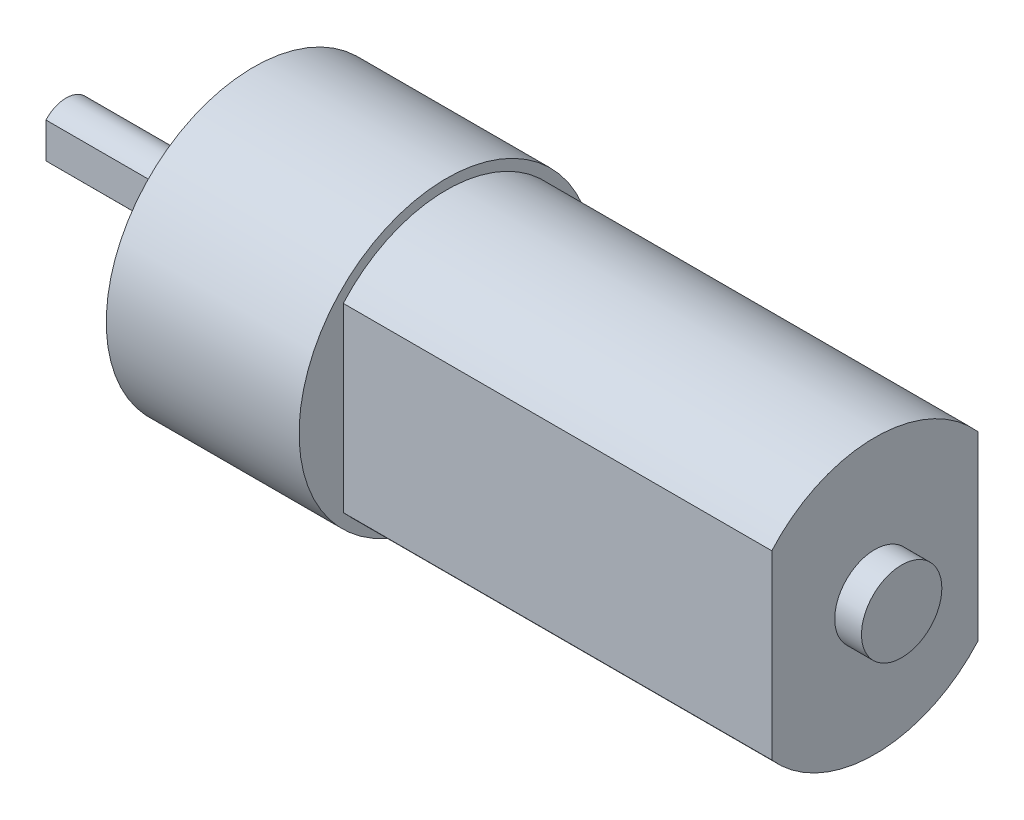
ISO-10303-21;
HEADER;
FILE_DESCRIPTION(('STEP AP214'),'2;1');
FILE_NAME('part.step','',(''),(''),'','','');
FILE_SCHEMA(('AUTOMOTIVE_DESIGN { 1 0 10303 214 1 1 1 1 }'));
ENDSEC;
DATA;
#1=APPLICATION_CONTEXT('core data for automotive mechanical design processes');
#2=APPLICATION_PROTOCOL_DEFINITION('international standard','automotive_design',2000,#1);
#3=PRODUCT_CONTEXT('',#1,'mechanical');
#4=PRODUCT('Part','Part','',(#3));
#5=PRODUCT_RELATED_PRODUCT_CATEGORY('part','',(#4));
#6=PRODUCT_DEFINITION_FORMATION('','',#4);
#7=PRODUCT_DEFINITION_CONTEXT('part definition',#1,'design');
#8=PRODUCT_DEFINITION('design','',#6,#7);
#9=PRODUCT_DEFINITION_SHAPE('','',#8);
#10=(LENGTH_UNIT() NAMED_UNIT(*) SI_UNIT(.MILLI.,.METRE.));
#11=(NAMED_UNIT(*) PLANE_ANGLE_UNIT() SI_UNIT($,.RADIAN.));
#12=(NAMED_UNIT(*) SI_UNIT($,.STERADIAN.) SOLID_ANGLE_UNIT());
#13=UNCERTAINTY_MEASURE_WITH_UNIT(LENGTH_MEASURE(1.E-05),#10,'distance_accuracy_value','');
#14=(GEOMETRIC_REPRESENTATION_CONTEXT(3) GLOBAL_UNCERTAINTY_ASSIGNED_CONTEXT((#13)) GLOBAL_UNIT_ASSIGNED_CONTEXT((#10,
#11,#12)) REPRESENTATION_CONTEXT('',''));
#15=CARTESIAN_POINT('',(0.,0.,0.));
#16=DIRECTION('',(0.,0.,1.));
#17=DIRECTION('',(1.,0.,0.));
#18=AXIS2_PLACEMENT_3D('',#15,#16,#17);
#19=CARTESIAN_POINT('',(38.7033994714384,0.,0.));
#20=DIRECTION('',(1.,0.,0.));
#21=DIRECTION('',(0.,0.,-1.));
#22=AXIS2_PLACEMENT_3D('',#19,#20,#21);
#23=CYLINDRICAL_SURFACE('',#22,7.00000000000001);
#24=CARTESIAN_POINT('',(-2.,0.,0.));
#25=DIRECTION('',(1.,0.,0.));
#26=DIRECTION('',(0.,0.,-1.));
#27=AXIS2_PLACEMENT_3D('',#24,#25,#26);
#28=CIRCLE('',#27,7.00000000000001);
#29=CARTESIAN_POINT('',(-2.,1.69313093032285,6.79215044391569));
#30=VERTEX_POINT('',#29);
#31=CARTESIAN_POINT('',(-2.,-6.79215044391568,-1.69313093032292));
#32=VERTEX_POINT('',#31);
#33=EDGE_CURVE('E187',#30,#32,#28,.T.);
#34=ORIENTED_EDGE('',*,*,#33,.T.);
#35=DIRECTION('',(-1.,0.,0.));
#36=VECTOR('',#35,1.);
#37=CARTESIAN_POINT('',(7.211102550928,-6.79215044391568,-1.69313093032292));
#38=LINE('',#37,#36);
#39=CARTESIAN_POINT('',(0.,-6.79215044391568,-1.69313093032292));
#40=VERTEX_POINT('',#39);
#41=EDGE_CURVE('E463',#40,#32,#38,.T.);
#42=ORIENTED_EDGE('',*,*,#41,.F.);
#43=CARTESIAN_POINT('',(0.,0.,0.));
#44=DIRECTION('',(1.,0.,0.));
#45=DIRECTION('',(0.,0.,-1.));
#46=AXIS2_PLACEMENT_3D('',#43,#44,#45);
#47=CIRCLE('',#46,7.00000000000001);
#48=CARTESIAN_POINT('',(0.,1.69313093032285,6.79215044391569));
#49=VERTEX_POINT('',#48);
#50=EDGE_CURVE('E178',#49,#40,#47,.T.);
#51=ORIENTED_EDGE('',*,*,#50,.F.);
#52=DIRECTION('',(-1.,0.,0.));
#53=VECTOR('',#52,1.);
#54=CARTESIAN_POINT('',(7.211102550928,1.69313093032285,6.79215044391569));
#55=LINE('',#54,#53);
#56=EDGE_CURVE('E461',#49,#30,#55,.T.);
#57=ORIENTED_EDGE('',*,*,#56,.T.);
#58=EDGE_LOOP('',(#34,#42,#51,#57));
#59=FACE_BOUND('',#58,.T.);
#60=ADVANCED_FACE('F33',(#59),#23,.T.);
#61=CARTESIAN_POINT('',(38.7033994714384,0.,0.));
#62=DIRECTION('',(1.,0.,0.));
#63=DIRECTION('',(0.,0.,-1.));
#64=AXIS2_PLACEMENT_3D('',#61,#62,#63);
#65=CYLINDRICAL_SURFACE('',#64,10.25);
#66=CARTESIAN_POINT('',(14.4,0.,0.));
#67=DIRECTION('',(1.,0.,0.));
#68=DIRECTION('',(0.,0.,-1.));
#69=AXIS2_PLACEMENT_3D('',#66,#67,#68);
#70=CIRCLE('',#69,10.25);
#71=CARTESIAN_POINT('',(14.4,-6.76553767264657,7.7));
#72=VERTEX_POINT('',#71);
#73=CARTESIAN_POINT('',(14.4,-6.76553767264657,-7.7));
#74=VERTEX_POINT('',#73);
#75=EDGE_CURVE('E448',#72,#74,#70,.T.);
#76=ORIENTED_EDGE('',*,*,#75,.T.);
#77=DIRECTION('',(1.,0.,0.));
#78=VECTOR('',#77,1.);
#79=CARTESIAN_POINT('',(38.7033994714384,-6.76553767264657,-7.7));
#80=LINE('',#79,#78);
#81=CARTESIAN_POINT('',(46.4,-6.76553767264656,-7.7));
#82=VERTEX_POINT('',#81);
#83=EDGE_CURVE('E480',#74,#82,#80,.T.);
#84=ORIENTED_EDGE('',*,*,#83,.T.);
#85=CARTESIAN_POINT('',(46.4,0.,0.));
#86=DIRECTION('',(1.,0.,0.));
#87=DIRECTION('',(0.,0.,-1.));
#88=AXIS2_PLACEMENT_3D('',#85,#86,#87);
#89=CIRCLE('',#88,10.25);
#90=CARTESIAN_POINT('',(46.4,-6.76553767264657,7.7));
#91=VERTEX_POINT('',#90);
#92=EDGE_CURVE('E440',#91,#82,#89,.T.);
#93=ORIENTED_EDGE('',*,*,#92,.F.);
#94=DIRECTION('',(1.,0.,0.));
#95=VECTOR('',#94,1.);
#96=CARTESIAN_POINT('',(38.7033994714384,-6.76553767264657,7.7));
#97=LINE('',#96,#95);
#98=EDGE_CURVE('E486',#91,#72,#97,.F.);
#99=ORIENTED_EDGE('',*,*,#98,.T.);
#100=EDGE_LOOP('',(#76,#84,#93,#99));
#101=FACE_BOUND('',#100,.T.);
#102=ADVANCED_FACE('F144',(#101),#65,.T.);
#103=CARTESIAN_POINT('',(-14.,0.,0.));
#104=DIRECTION('',(1.,0.,0.));
#105=DIRECTION('',(0.,0.,-1.));
#106=AXIS2_PLACEMENT_3D('',#103,#104,#105);
#107=PLANE('',#106);
#108=CARTESIAN_POINT('',(-14.,0.,0.));
#109=DIRECTION('',(1.,0.,0.));
#110=DIRECTION('',(0.,0.,-1.));
#111=AXIS2_PLACEMENT_3D('',#108,#109,#110);
#112=CIRCLE('',#111,2.00000000000001);
#113=CARTESIAN_POINT('',(-14.,-1.32287565553231,1.49999999999999));
#114=VERTEX_POINT('',#113);
#115=CARTESIAN_POINT('',(-14.,1.32287565553231,1.49999999999999));
#116=VERTEX_POINT('',#115);
#117=EDGE_CURVE('E117',#114,#116,#112,.T.);
#118=ORIENTED_EDGE('',*,*,#117,.F.);
#119=DIRECTION('',(0.,-1.,0.));
#120=VECTOR('',#119,1.);
#121=CARTESIAN_POINT('',(-14.,9.36225720990517,1.49999999999999));
#122=LINE('',#121,#120);
#123=EDGE_CURVE('E110',#116,#114,#122,.T.);
#124=ORIENTED_EDGE('',*,*,#123,.F.);
#125=EDGE_LOOP('',(#118,#124));
#126=FACE_BOUND('',#125,.T.);
#127=ADVANCED_FACE('F35',(#126),#107,.F.);
#128=CARTESIAN_POINT('',(38.7033994714384,0.,0.));
#129=DIRECTION('',(1.,0.,0.));
#130=DIRECTION('',(0.,0.,-1.));
#131=AXIS2_PLACEMENT_3D('',#128,#129,#130);
#132=CYLINDRICAL_SURFACE('',#131,2.00000000000001);
#133=ORIENTED_EDGE('',*,*,#117,.T.);
#134=DIRECTION('',(1.,0.,0.));
#135=VECTOR('',#134,1.);
#136=CARTESIAN_POINT('',(38.7033994714384,1.32287565553231,1.49999999999999));
#137=LINE('',#136,#135);
#138=CARTESIAN_POINT('',(-6.00000000000001,1.32287565553231,1.49999999999999));
#139=VERTEX_POINT('',#138);
#140=EDGE_CURVE('E11',#116,#139,#137,.T.);
#141=ORIENTED_EDGE('',*,*,#140,.T.);
#142=CARTESIAN_POINT('',(-6.00000000000001,0.,0.));
#143=DIRECTION('',(1.,0.,0.));
#144=DIRECTION('',(0.,0.,-1.));
#145=AXIS2_PLACEMENT_3D('',#142,#143,#144);
#146=CIRCLE('',#145,2.00000000000001);
#147=CARTESIAN_POINT('',(-6.00000000000001,-1.32287565553231,1.49999999999999));
#148=VERTEX_POINT('',#147);
#149=EDGE_CURVE('E134',#139,#148,#146,.T.);
#150=ORIENTED_EDGE('',*,*,#149,.T.);
#151=DIRECTION('',(1.,0.,0.));
#152=VECTOR('',#151,1.);
#153=CARTESIAN_POINT('',(38.7033994714384,-1.32287565553231,1.49999999999999));
#154=LINE('',#153,#152);
#155=EDGE_CURVE('E41',#148,#114,#154,.F.);
#156=ORIENTED_EDGE('',*,*,#155,.T.);
#157=EDGE_LOOP('',(#133,#141,#150,#156));
#158=FACE_BOUND('',#157,.T.);
#159=CARTESIAN_POINT('',(-3.,0.,0.));
#160=DIRECTION('',(1.,0.,0.));
#161=DIRECTION('',(0.,0.,-1.));
#162=AXIS2_PLACEMENT_3D('',#159,#160,#161);
#163=CIRCLE('',#162,2.00000000000001);
#164=CARTESIAN_POINT('',(-3.,0.,-2.00000000000001));
#165=VERTEX_POINT('',#164);
#166=EDGE_CURVE('E122',#165,#165,#163,.T.);
#167=ORIENTED_EDGE('',*,*,#166,.F.);
#168=EDGE_LOOP('',(#167));
#169=FACE_BOUND('',#168,.T.);
#170=ADVANCED_FACE('F119',(#158,#169),#132,.T.);
#171=CARTESIAN_POINT('',(-3.,-2.00000000000001,0.));
#172=DIRECTION('',(1.,0.,0.));
#173=DIRECTION('',(0.,0.,-1.));
#174=AXIS2_PLACEMENT_3D('',#171,#172,#173);
#175=PLANE('',#174);
#176=CARTESIAN_POINT('',(-3.,0.,0.));
#177=DIRECTION('',(1.,0.,0.));
#178=DIRECTION('',(0.,0.,-1.));
#179=AXIS2_PLACEMENT_3D('',#176,#177,#178);
#180=CIRCLE('',#179,4.00000000000001);
#181=CARTESIAN_POINT('',(-3.,0.,-4.00000000000001));
#182=VERTEX_POINT('',#181);
#183=EDGE_CURVE('E128',#182,#182,#180,.T.);
#184=ORIENTED_EDGE('',*,*,#183,.F.);
#185=EDGE_LOOP('',(#184));
#186=FACE_BOUND('',#185,.T.);
#187=ORIENTED_EDGE('',*,*,#166,.T.);
#188=EDGE_LOOP('',(#187));
#189=FACE_BOUND('',#188,.T.);
#190=ADVANCED_FACE('F195',(#186,#189),#175,.F.);
#191=CARTESIAN_POINT('',(38.7033994714384,0.,0.));
#192=DIRECTION('',(1.,0.,0.));
#193=DIRECTION('',(0.,0.,-1.));
#194=AXIS2_PLACEMENT_3D('',#191,#192,#193);
#195=CYLINDRICAL_SURFACE('',#194,4.00000000000001);
#196=CARTESIAN_POINT('',(-2.,0.,0.));
#197=DIRECTION('',(1.,0.,0.));
#198=DIRECTION('',(0.,0.,-1.));
#199=AXIS2_PLACEMENT_3D('',#196,#197,#198);
#200=CIRCLE('',#199,4.00000000000001);
#201=CARTESIAN_POINT('',(-2.,0.,-4.00000000000001));
#202=VERTEX_POINT('',#201);
#203=EDGE_CURVE('E189',#202,#202,#200,.T.);
#204=ORIENTED_EDGE('',*,*,#203,.F.);
#205=EDGE_LOOP('',(#204));
#206=FACE_BOUND('',#205,.T.);
#207=ORIENTED_EDGE('',*,*,#183,.T.);
#208=EDGE_LOOP('',(#207));
#209=FACE_BOUND('',#208,.T.);
#210=ADVANCED_FACE('F167',(#206,#209),#195,.T.);
#211=CARTESIAN_POINT('',(-2.,-4.00000000000001,0.));
#212=DIRECTION('',(1.,0.,0.));
#213=DIRECTION('',(0.,0.,-1.));
#214=AXIS2_PLACEMENT_3D('',#211,#212,#213);
#215=PLANE('',#214);
#216=CARTESIAN_POINT('',(-2.,-1.69313093032285,-6.79215044391569));
#217=VERTEX_POINT('',#216);
#218=CARTESIAN_POINT('',(-2.,6.79215044391567,1.69313093032292));
#219=VERTEX_POINT('',#218);
#220=EDGE_CURVE('E181',#217,#219,#28,.T.);
#221=ORIENTED_EDGE('',*,*,#220,.F.);
#222=DIRECTION('',(0.,0.707106781186551,-0.707106781186544));
#223=VECTOR('',#222,1.);
#224=CARTESIAN_POINT('',(-2.,-1.69313093032285,-6.79215044391569));
#225=LINE('',#224,#223);
#226=EDGE_CURVE('E497',#32,#217,#225,.T.);
#227=ORIENTED_EDGE('',*,*,#226,.F.);
#228=ORIENTED_EDGE('',*,*,#33,.F.);
#229=DIRECTION('',(0.,-0.707106781186551,0.707106781186544));
#230=VECTOR('',#229,1.);
#231=CARTESIAN_POINT('',(-2.,1.69313093032285,6.79215044391569));
#232=LINE('',#231,#230);
#233=EDGE_CURVE('E465',#219,#30,#232,.T.);
#234=ORIENTED_EDGE('',*,*,#233,.F.);
#235=EDGE_LOOP('',(#221,#227,#228,#234));
#236=FACE_BOUND('',#235,.T.);
#237=ORIENTED_EDGE('',*,*,#203,.T.);
#238=EDGE_LOOP('',(#237));
#239=FACE_BOUND('',#238,.T.);
#240=ADVANCED_FACE('F159',(#236,#239),#215,.F.);
#241=CARTESIAN_POINT('',(0.,-1.69313093032285,-6.79215044391569));
#242=VERTEX_POINT('',#241);
#243=CARTESIAN_POINT('',(0.,6.79215044391567,1.69313093032292));
#244=VERTEX_POINT('',#243);
#245=EDGE_CURVE('E172',#242,#244,#47,.T.);
#246=ORIENTED_EDGE('',*,*,#245,.F.);
#247=DIRECTION('',(-1.,0.,0.));
#248=VECTOR('',#247,1.);
#249=CARTESIAN_POINT('',(7.211102550928,-1.69313093032285,-6.79215044391569));
#250=LINE('',#249,#248);
#251=EDGE_CURVE('E173',#242,#217,#250,.T.);
#252=ORIENTED_EDGE('',*,*,#251,.T.);
#253=ORIENTED_EDGE('',*,*,#220,.T.);
#254=DIRECTION('',(-1.,0.,0.));
#255=VECTOR('',#254,1.);
#256=CARTESIAN_POINT('',(7.211102550928,6.79215044391567,1.69313093032292));
#257=LINE('',#256,#255);
#258=EDGE_CURVE('E176',#244,#219,#257,.T.);
#259=ORIENTED_EDGE('',*,*,#258,.F.);
#260=EDGE_LOOP('',(#246,#252,#253,#259));
#261=FACE_BOUND('',#260,.T.);
#262=ADVANCED_FACE('F147',(#261),#23,.T.);
#263=CARTESIAN_POINT('',(0.,-7.00000000000001,0.));
#264=DIRECTION('',(1.,0.,0.));
#265=DIRECTION('',(0.,0.,-1.));
#266=AXIS2_PLACEMENT_3D('',#263,#264,#265);
#267=PLANE('',#266);
#268=CARTESIAN_POINT('',(0.,0.,-9.));
#269=DIRECTION('',(-1.,0.,0.));
#270=DIRECTION('',(0.,0.,1.));
#271=AXIS2_PLACEMENT_3D('',#268,#269,#270);
#272=CIRCLE('',#271,1.);
#273=CARTESIAN_POINT('',(0.,0.,-8.));
#274=VERTEX_POINT('',#273);
#275=EDGE_CURVE('E519',#274,#274,#272,.T.);
#276=ORIENTED_EDGE('',*,*,#275,.F.);
#277=EDGE_LOOP('',(#276));
#278=FACE_BOUND('',#277,.T.);
#279=CARTESIAN_POINT('',(0.,-9.,0.));
#280=DIRECTION('',(-1.,0.,0.));
#281=DIRECTION('',(0.,0.,1.));
#282=AXIS2_PLACEMENT_3D('',#279,#280,#281);
#283=CIRCLE('',#282,1.);
#284=CARTESIAN_POINT('',(0.,-9.,1.));
#285=VERTEX_POINT('',#284);
#286=EDGE_CURVE('E513',#285,#285,#283,.T.);
#287=ORIENTED_EDGE('',*,*,#286,.F.);
#288=EDGE_LOOP('',(#287));
#289=FACE_BOUND('',#288,.T.);
#290=CARTESIAN_POINT('',(0.,0.,9.));
#291=DIRECTION('',(-1.,0.,0.));
#292=DIRECTION('',(0.,0.,1.));
#293=AXIS2_PLACEMENT_3D('',#290,#291,#292);
#294=CIRCLE('',#293,1.);
#295=CARTESIAN_POINT('',(0.,0.,10.));
#296=VERTEX_POINT('',#295);
#297=EDGE_CURVE('E507',#296,#296,#294,.T.);
#298=ORIENTED_EDGE('',*,*,#297,.F.);
#299=EDGE_LOOP('',(#298));
#300=FACE_BOUND('',#299,.T.);
#301=CARTESIAN_POINT('',(0.,9.,0.));
#302=DIRECTION('',(-1.,0.,0.));
#303=DIRECTION('',(0.,0.,1.));
#304=AXIS2_PLACEMENT_3D('',#301,#302,#303);
#305=CIRCLE('',#304,1.);
#306=CARTESIAN_POINT('',(0.,9.,1.));
#307=VERTEX_POINT('',#306);
#308=EDGE_CURVE('E501',#307,#307,#305,.T.);
#309=ORIENTED_EDGE('',*,*,#308,.F.);
#310=EDGE_LOOP('',(#309));
#311=FACE_BOUND('',#310,.T.);
#312=CARTESIAN_POINT('',(0.,0.,0.));
#313=DIRECTION('',(1.,0.,0.));
#314=DIRECTION('',(0.,0.,-1.));
#315=AXIS2_PLACEMENT_3D('',#312,#313,#314);
#316=CIRCLE('',#315,11.);
#317=CARTESIAN_POINT('',(0.,0.,-11.));
#318=VERTEX_POINT('',#317);
#319=EDGE_CURVE('E179',#318,#318,#316,.T.);
#320=ORIENTED_EDGE('',*,*,#319,.F.);
#321=EDGE_LOOP('',(#320));
#322=FACE_BOUND('',#321,.T.);
#323=ORIENTED_EDGE('',*,*,#50,.T.);
#324=DIRECTION('',(0.,0.707106781186551,-0.707106781186544));
#325=VECTOR('',#324,1.);
#326=CARTESIAN_POINT('',(0.,-1.69313093032285,-6.79215044391569));
#327=LINE('',#326,#325);
#328=EDGE_CURVE('E55',#40,#242,#327,.T.);
#329=ORIENTED_EDGE('',*,*,#328,.T.);
#330=ORIENTED_EDGE('',*,*,#245,.T.);
#331=DIRECTION('',(0.,-0.707106781186551,0.707106781186544));
#332=VECTOR('',#331,1.);
#333=CARTESIAN_POINT('',(0.,1.69313093032285,6.79215044391569));
#334=LINE('',#333,#332);
#335=EDGE_CURVE('E457',#244,#49,#334,.T.);
#336=ORIENTED_EDGE('',*,*,#335,.T.);
#337=EDGE_LOOP('',(#323,#329,#330,#336));
#338=FACE_BOUND('',#337,.T.);
#339=ADVANCED_FACE('F158',(#278,#289,#300,#311,#322,#338),#267,.F.);
#340=CARTESIAN_POINT('',(38.7033994714384,0.,0.));
#341=DIRECTION('',(1.,0.,0.));
#342=DIRECTION('',(0.,0.,-1.));
#343=AXIS2_PLACEMENT_3D('',#340,#341,#342);
#344=CYLINDRICAL_SURFACE('',#343,11.);
#345=CARTESIAN_POINT('',(14.4,0.,0.));
#346=DIRECTION('',(1.,0.,0.));
#347=DIRECTION('',(0.,0.,-1.));
#348=AXIS2_PLACEMENT_3D('',#345,#346,#347);
#349=CIRCLE('',#348,11.);
#350=CARTESIAN_POINT('',(14.4,0.,-11.));
#351=VERTEX_POINT('',#350);
#352=EDGE_CURVE('E183',#351,#351,#349,.T.);
#353=ORIENTED_EDGE('',*,*,#352,.F.);
#354=EDGE_LOOP('',(#353));
#355=FACE_BOUND('',#354,.T.);
#356=ORIENTED_EDGE('',*,*,#319,.T.);
#357=EDGE_LOOP('',(#356));
#358=FACE_BOUND('',#357,.T.);
#359=ADVANCED_FACE('F165',(#355,#358),#344,.T.);
#360=CARTESIAN_POINT('',(14.4,-11.,0.));
#361=DIRECTION('',(-1.,0.,0.));
#362=DIRECTION('',(0.,0.,1.));
#363=AXIS2_PLACEMENT_3D('',#360,#361,#362);
#364=PLANE('',#363);
#365=DIRECTION('',(0.,-1.,0.));
#366=VECTOR('',#365,1.);
#367=CARTESIAN_POINT('',(14.4,-12.1760425529863,-7.7));
#368=LINE('',#367,#366);
#369=CARTESIAN_POINT('',(14.4,6.76553767264657,-7.7));
#370=VERTEX_POINT('',#369);
#371=EDGE_CURVE('E474',#370,#74,#368,.T.);
#372=ORIENTED_EDGE('',*,*,#371,.T.);
#373=ORIENTED_EDGE('',*,*,#75,.F.);
#374=DIRECTION('',(0.,1.,0.));
#375=VECTOR('',#374,1.);
#376=CARTESIAN_POINT('',(14.4,11.1958328380294,7.7));
#377=LINE('',#376,#375);
#378=CARTESIAN_POINT('',(14.4,6.76553767264656,7.7));
#379=VERTEX_POINT('',#378);
#380=EDGE_CURVE('E483',#72,#379,#377,.T.);
#381=ORIENTED_EDGE('',*,*,#380,.T.);
#382=EDGE_CURVE('E447',#370,#379,#70,.T.);
#383=ORIENTED_EDGE('',*,*,#382,.F.);
#384=EDGE_LOOP('',(#372,#373,#381,#383));
#385=FACE_BOUND('',#384,.T.);
#386=ORIENTED_EDGE('',*,*,#352,.T.);
#387=EDGE_LOOP('',(#386));
#388=FACE_BOUND('',#387,.T.);
#389=ADVANCED_FACE('F372',(#385,#388),#364,.F.);
#390=CARTESIAN_POINT('',(46.4,6.76553767264656,-7.7));
#391=VERTEX_POINT('',#390);
#392=CARTESIAN_POINT('',(46.4,6.76553767264656,7.7));
#393=VERTEX_POINT('',#392);
#394=EDGE_CURVE('E438',#391,#393,#89,.T.);
#395=ORIENTED_EDGE('',*,*,#394,.F.);
#396=DIRECTION('',(1.,0.,0.));
#397=VECTOR('',#396,1.);
#398=CARTESIAN_POINT('',(38.7033994714384,6.76553767264657,-7.7));
#399=LINE('',#398,#397);
#400=EDGE_CURVE('E477',#391,#370,#399,.F.);
#401=ORIENTED_EDGE('',*,*,#400,.T.);
#402=ORIENTED_EDGE('',*,*,#382,.T.);
#403=DIRECTION('',(1.,0.,0.));
#404=VECTOR('',#403,1.);
#405=CARTESIAN_POINT('',(38.7033994714384,6.76553767264656,7.7));
#406=LINE('',#405,#404);
#407=EDGE_CURVE('E442',#379,#393,#406,.T.);
#408=ORIENTED_EDGE('',*,*,#407,.T.);
#409=EDGE_LOOP('',(#395,#401,#402,#408));
#410=FACE_BOUND('',#409,.T.);
#411=ADVANCED_FACE('F153',(#410),#65,.T.);
#412=CARTESIAN_POINT('',(46.4,-10.25,0.));
#413=DIRECTION('',(-1.,0.,0.));
#414=DIRECTION('',(0.,0.,1.));
#415=AXIS2_PLACEMENT_3D('',#412,#413,#414);
#416=PLANE('',#415);
#417=CARTESIAN_POINT('',(46.4,0.,0.));
#418=DIRECTION('',(1.,0.,0.));
#419=DIRECTION('',(0.,0.,-1.));
#420=AXIS2_PLACEMENT_3D('',#417,#418,#419);
#421=CIRCLE('',#420,3.);
#422=CARTESIAN_POINT('',(46.4,0.,-3.));
#423=VERTEX_POINT('',#422);
#424=EDGE_CURVE('E437',#423,#423,#421,.T.);
#425=ORIENTED_EDGE('',*,*,#424,.F.);
#426=EDGE_LOOP('',(#425));
#427=FACE_BOUND('',#426,.T.);
#428=ORIENTED_EDGE('',*,*,#92,.T.);
#429=DIRECTION('',(0.,1.,0.));
#430=VECTOR('',#429,1.);
#431=CARTESIAN_POINT('',(46.4,-10.25,-7.7));
#432=LINE('',#431,#430);
#433=EDGE_CURVE('E125',#82,#391,#432,.T.);
#434=ORIENTED_EDGE('',*,*,#433,.T.);
#435=ORIENTED_EDGE('',*,*,#394,.T.);
#436=DIRECTION('',(0.,-1.,0.));
#437=VECTOR('',#436,1.);
#438=CARTESIAN_POINT('',(46.4,-10.25,7.7));
#439=LINE('',#438,#437);
#440=EDGE_CURVE('E121',#393,#91,#439,.T.);
#441=ORIENTED_EDGE('',*,*,#440,.T.);
#442=EDGE_LOOP('',(#428,#434,#435,#441));
#443=FACE_BOUND('',#442,.T.);
#444=ADVANCED_FACE('F392',(#427,#443),#416,.F.);
#445=CARTESIAN_POINT('',(38.7033994714384,0.,0.));
#446=DIRECTION('',(1.,0.,0.));
#447=DIRECTION('',(0.,0.,-1.));
#448=AXIS2_PLACEMENT_3D('',#445,#446,#447);
#449=CYLINDRICAL_SURFACE('',#448,3.);
#450=CARTESIAN_POINT('',(48.4,0.,0.));
#451=DIRECTION('',(1.,0.,0.));
#452=DIRECTION('',(0.,0.,-1.));
#453=AXIS2_PLACEMENT_3D('',#450,#451,#452);
#454=CIRCLE('',#453,3.);
#455=CARTESIAN_POINT('',(48.4,0.,-3.));
#456=VERTEX_POINT('',#455);
#457=EDGE_CURVE('E434',#456,#456,#454,.T.);
#458=ORIENTED_EDGE('',*,*,#457,.F.);
#459=EDGE_LOOP('',(#458));
#460=FACE_BOUND('',#459,.T.);
#461=ORIENTED_EDGE('',*,*,#424,.T.);
#462=EDGE_LOOP('',(#461));
#463=FACE_BOUND('',#462,.T.);
#464=ADVANCED_FACE('F401',(#460,#463),#449,.T.);
#465=CARTESIAN_POINT('',(48.4,-3.,0.));
#466=DIRECTION('',(-1.,0.,0.));
#467=DIRECTION('',(0.,0.,1.));
#468=AXIS2_PLACEMENT_3D('',#465,#466,#467);
#469=PLANE('',#468);
#470=ORIENTED_EDGE('',*,*,#457,.T.);
#471=EDGE_LOOP('',(#470));
#472=FACE_BOUND('',#471,.T.);
#473=ADVANCED_FACE('F366',(#472),#469,.F.);
#474=CARTESIAN_POINT('',(-10.4087080168336,11.1958328380294,7.7));
#475=DIRECTION('',(0.,0.,-1.));
#476=DIRECTION('',(0.,1.,0.));
#477=AXIS2_PLACEMENT_3D('',#474,#475,#476);
#478=PLANE('',#477);
#479=ORIENTED_EDGE('',*,*,#380,.F.);
#480=ORIENTED_EDGE('',*,*,#98,.F.);
#481=ORIENTED_EDGE('',*,*,#440,.F.);
#482=ORIENTED_EDGE('',*,*,#407,.F.);
#483=EDGE_LOOP('',(#479,#480,#481,#482));
#484=FACE_BOUND('',#483,.T.);
#485=ADVANCED_FACE('F409',(#484),#478,.F.);
#486=CARTESIAN_POINT('',(-10.4087080168336,-12.1760425529863,-7.7));
#487=DIRECTION('',(0.,0.,1.));
#488=DIRECTION('',(0.,-1.,0.));
#489=AXIS2_PLACEMENT_3D('',#486,#487,#488);
#490=PLANE('',#489);
#491=ORIENTED_EDGE('',*,*,#371,.F.);
#492=ORIENTED_EDGE('',*,*,#400,.F.);
#493=ORIENTED_EDGE('',*,*,#433,.F.);
#494=ORIENTED_EDGE('',*,*,#83,.F.);
#495=EDGE_LOOP('',(#491,#492,#493,#494));
#496=FACE_BOUND('',#495,.T.);
#497=ADVANCED_FACE('F238',(#496),#490,.F.);
#498=CARTESIAN_POINT('',(7.211102550928,1.69313093032285,6.79215044391569));
#499=DIRECTION('',(0.,-0.707106781186544,-0.707106781186551));
#500=DIRECTION('',(0.,0.707106781186551,-0.707106781186544));
#501=AXIS2_PLACEMENT_3D('',#498,#499,#500);
#502=PLANE('',#501);
#503=ORIENTED_EDGE('',*,*,#258,.T.);
#504=ORIENTED_EDGE('',*,*,#233,.T.);
#505=ORIENTED_EDGE('',*,*,#56,.F.);
#506=ORIENTED_EDGE('',*,*,#335,.F.);
#507=EDGE_LOOP('',(#503,#504,#505,#506));
#508=FACE_BOUND('',#507,.T.);
#509=ADVANCED_FACE('F232',(#508),#502,.F.);
#510=CARTESIAN_POINT('',(7.211102550928,-1.69313093032285,-6.79215044391569));
#511=DIRECTION('',(0.,0.707106781186544,0.707106781186551));
#512=DIRECTION('',(0.,-0.707106781186551,0.707106781186544));
#513=AXIS2_PLACEMENT_3D('',#510,#511,#512);
#514=PLANE('',#513);
#515=ORIENTED_EDGE('',*,*,#41,.T.);
#516=ORIENTED_EDGE('',*,*,#226,.T.);
#517=ORIENTED_EDGE('',*,*,#251,.F.);
#518=ORIENTED_EDGE('',*,*,#328,.F.);
#519=EDGE_LOOP('',(#515,#516,#517,#518));
#520=FACE_BOUND('',#519,.T.);
#521=ADVANCED_FACE('F237',(#520),#514,.F.);
#522=CARTESIAN_POINT('',(4.,9.,0.));
#523=DIRECTION('',(-1.,0.,0.));
#524=DIRECTION('',(0.,0.,1.));
#525=AXIS2_PLACEMENT_3D('',#522,#523,#524);
#526=CYLINDRICAL_SURFACE('',#525,1.);
#527=CARTESIAN_POINT('',(4.,9.,0.));
#528=DIRECTION('',(-1.,0.,0.));
#529=DIRECTION('',(0.,0.,1.));
#530=AXIS2_PLACEMENT_3D('',#527,#528,#529);
#531=CIRCLE('',#530,1.);
#532=CARTESIAN_POINT('',(4.,9.,1.));
#533=VERTEX_POINT('',#532);
#534=EDGE_CURVE('E498',#533,#533,#531,.T.);
#535=ORIENTED_EDGE('',*,*,#534,.F.);
#536=EDGE_LOOP('',(#535));
#537=FACE_BOUND('',#536,.T.);
#538=ORIENTED_EDGE('',*,*,#308,.T.);
#539=EDGE_LOOP('',(#538));
#540=FACE_BOUND('',#539,.T.);
#541=ADVANCED_FACE('F250',(#537,#540),#526,.F.);
#542=CARTESIAN_POINT('',(4.,9.,0.));
#543=DIRECTION('',(-1.,0.,0.));
#544=DIRECTION('',(0.,0.,1.));
#545=AXIS2_PLACEMENT_3D('',#542,#543,#544);
#546=PLANE('',#545);
#547=ORIENTED_EDGE('',*,*,#534,.T.);
#548=EDGE_LOOP('',(#547));
#549=FACE_BOUND('',#548,.T.);
#550=ADVANCED_FACE('F266',(#549),#546,.T.);
#551=CARTESIAN_POINT('',(4.,0.,9.));
#552=DIRECTION('',(-1.,0.,0.));
#553=DIRECTION('',(0.,0.,1.));
#554=AXIS2_PLACEMENT_3D('',#551,#552,#553);
#555=CYLINDRICAL_SURFACE('',#554,1.);
#556=CARTESIAN_POINT('',(4.,0.,9.));
#557=DIRECTION('',(-1.,0.,0.));
#558=DIRECTION('',(0.,0.,1.));
#559=AXIS2_PLACEMENT_3D('',#556,#557,#558);
#560=CIRCLE('',#559,1.);
#561=CARTESIAN_POINT('',(4.,0.,10.));
#562=VERTEX_POINT('',#561);
#563=EDGE_CURVE('E510',#562,#562,#560,.T.);
#564=ORIENTED_EDGE('',*,*,#563,.F.);
#565=EDGE_LOOP('',(#564));
#566=FACE_BOUND('',#565,.T.);
#567=ORIENTED_EDGE('',*,*,#297,.T.);
#568=EDGE_LOOP('',(#567));
#569=FACE_BOUND('',#568,.T.);
#570=ADVANCED_FACE('F276',(#566,#569),#555,.F.);
#571=CARTESIAN_POINT('',(4.,0.,9.));
#572=DIRECTION('',(-1.,0.,0.));
#573=DIRECTION('',(0.,0.,1.));
#574=AXIS2_PLACEMENT_3D('',#571,#572,#573);
#575=PLANE('',#574);
#576=ORIENTED_EDGE('',*,*,#563,.T.);
#577=EDGE_LOOP('',(#576));
#578=FACE_BOUND('',#577,.T.);
#579=ADVANCED_FACE('F286',(#578),#575,.T.);
#580=CARTESIAN_POINT('',(4.,-9.,0.));
#581=DIRECTION('',(-1.,0.,0.));
#582=DIRECTION('',(0.,0.,1.));
#583=AXIS2_PLACEMENT_3D('',#580,#581,#582);
#584=CYLINDRICAL_SURFACE('',#583,1.);
#585=CARTESIAN_POINT('',(4.,-9.,0.));
#586=DIRECTION('',(-1.,0.,0.));
#587=DIRECTION('',(0.,0.,1.));
#588=AXIS2_PLACEMENT_3D('',#585,#586,#587);
#589=CIRCLE('',#588,1.);
#590=CARTESIAN_POINT('',(4.,-9.,1.));
#591=VERTEX_POINT('',#590);
#592=EDGE_CURVE('E516',#591,#591,#589,.T.);
#593=ORIENTED_EDGE('',*,*,#592,.F.);
#594=EDGE_LOOP('',(#593));
#595=FACE_BOUND('',#594,.T.);
#596=ORIENTED_EDGE('',*,*,#286,.T.);
#597=EDGE_LOOP('',(#596));
#598=FACE_BOUND('',#597,.T.);
#599=ADVANCED_FACE('F296',(#595,#598),#584,.F.);
#600=CARTESIAN_POINT('',(4.,-9.,0.));
#601=DIRECTION('',(-1.,0.,0.));
#602=DIRECTION('',(0.,0.,1.));
#603=AXIS2_PLACEMENT_3D('',#600,#601,#602);
#604=PLANE('',#603);
#605=ORIENTED_EDGE('',*,*,#592,.T.);
#606=EDGE_LOOP('',(#605));
#607=FACE_BOUND('',#606,.T.);
#608=ADVANCED_FACE('F306',(#607),#604,.T.);
#609=CARTESIAN_POINT('',(4.,0.,-9.));
#610=DIRECTION('',(-1.,0.,0.));
#611=DIRECTION('',(0.,0.,1.));
#612=AXIS2_PLACEMENT_3D('',#609,#610,#611);
#613=CYLINDRICAL_SURFACE('',#612,1.);
#614=CARTESIAN_POINT('',(4.,0.,-9.));
#615=DIRECTION('',(-1.,0.,0.));
#616=DIRECTION('',(0.,0.,1.));
#617=AXIS2_PLACEMENT_3D('',#614,#615,#616);
#618=CIRCLE('',#617,1.);
#619=CARTESIAN_POINT('',(4.,0.,-8.));
#620=VERTEX_POINT('',#619);
#621=EDGE_CURVE('E505',#620,#620,#618,.T.);
#622=ORIENTED_EDGE('',*,*,#621,.F.);
#623=EDGE_LOOP('',(#622));
#624=FACE_BOUND('',#623,.T.);
#625=ORIENTED_EDGE('',*,*,#275,.T.);
#626=EDGE_LOOP('',(#625));
#627=FACE_BOUND('',#626,.T.);
#628=ADVANCED_FACE('F316',(#624,#627),#613,.F.);
#629=CARTESIAN_POINT('',(4.,0.,-9.));
#630=DIRECTION('',(-1.,0.,0.));
#631=DIRECTION('',(0.,0.,1.));
#632=AXIS2_PLACEMENT_3D('',#629,#630,#631);
#633=PLANE('',#632);
#634=ORIENTED_EDGE('',*,*,#621,.T.);
#635=EDGE_LOOP('',(#634));
#636=FACE_BOUND('',#635,.T.);
#637=ADVANCED_FACE('F141',(#636),#633,.T.);
#638=CARTESIAN_POINT('',(-6.,9.36225720990517,1.49999999999999));
#639=DIRECTION('',(0.,0.,-1.));
#640=DIRECTION('',(0.,1.,0.));
#641=AXIS2_PLACEMENT_3D('',#638,#639,#640);
#642=PLANE('',#641);
#643=ORIENTED_EDGE('',*,*,#123,.T.);
#644=ORIENTED_EDGE('',*,*,#155,.F.);
#645=DIRECTION('',(0.,-1.,0.));
#646=VECTOR('',#645,1.);
#647=CARTESIAN_POINT('',(-6.,9.36225720990517,1.49999999999999));
#648=LINE('',#647,#646);
#649=EDGE_CURVE('E47',#139,#148,#648,.T.);
#650=ORIENTED_EDGE('',*,*,#649,.F.);
#651=ORIENTED_EDGE('',*,*,#140,.F.);
#652=EDGE_LOOP('',(#643,#644,#650,#651));
#653=FACE_BOUND('',#652,.T.);
#654=ADVANCED_FACE('F109',(#653),#642,.F.);
#655=CARTESIAN_POINT('',(-6.,0.,0.));
#656=DIRECTION('',(1.,0.,0.));
#657=DIRECTION('',(0.,0.,-1.));
#658=AXIS2_PLACEMENT_3D('',#655,#656,#657);
#659=PLANE('',#658);
#660=ORIENTED_EDGE('',*,*,#649,.T.);
#661=ORIENTED_EDGE('',*,*,#149,.F.);
#662=EDGE_LOOP('',(#660,#661));
#663=FACE_BOUND('',#662,.T.);
#664=ADVANCED_FACE('F135',(#663),#659,.F.);
#665=CLOSED_SHELL('',(#60,#102,#127,#170,#190,#210,#240,#262,#339,#359,#389,#411,#444,#464,#473,
#485,#497,#509,#521,#541,#550,#570,#579,#599,#608,#628,#637,#654,#664));
#666=MANIFOLD_SOLID_BREP('B2',#665);
#667=ADVANCED_BREP_SHAPE_REPRESENTATION('',(#18,#666),#14);
#668=SHAPE_DEFINITION_REPRESENTATION(#9,#667);
ENDSEC;
END-ISO-10303-21;
